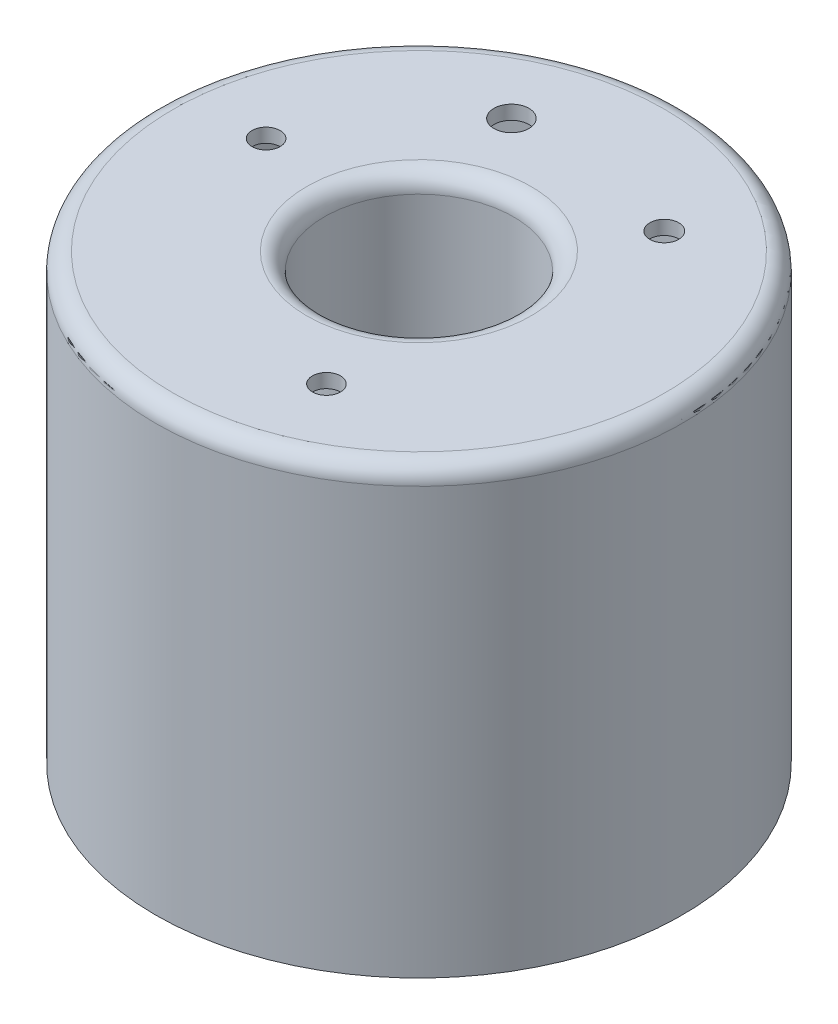
ISO-10303-21;
HEADER;
FILE_DESCRIPTION(('STEP AP214'),'2;1');
FILE_NAME('part.step','',(''),(''),'','','');
FILE_SCHEMA(('AUTOMOTIVE_DESIGN { 1 0 10303 214 1 1 1 1 }'));
ENDSEC;
DATA;
#1=APPLICATION_CONTEXT('core data for automotive mechanical design processes');
#2=APPLICATION_PROTOCOL_DEFINITION('international standard','automotive_design',2000,#1);
#3=PRODUCT_CONTEXT('',#1,'mechanical');
#4=PRODUCT('Part','Part','',(#3));
#5=PRODUCT_RELATED_PRODUCT_CATEGORY('part','',(#4));
#6=PRODUCT_DEFINITION_FORMATION('','',#4);
#7=PRODUCT_DEFINITION_CONTEXT('part definition',#1,'design');
#8=PRODUCT_DEFINITION('design','',#6,#7);
#9=PRODUCT_DEFINITION_SHAPE('','',#8);
#10=(LENGTH_UNIT() NAMED_UNIT(*) SI_UNIT(.MILLI.,.METRE.));
#11=(NAMED_UNIT(*) PLANE_ANGLE_UNIT() SI_UNIT($,.RADIAN.));
#12=(NAMED_UNIT(*) SI_UNIT($,.STERADIAN.) SOLID_ANGLE_UNIT());
#13=UNCERTAINTY_MEASURE_WITH_UNIT(LENGTH_MEASURE(1.E-05),#10,'distance_accuracy_value','');
#14=(GEOMETRIC_REPRESENTATION_CONTEXT(3) GLOBAL_UNCERTAINTY_ASSIGNED_CONTEXT((#13)) GLOBAL_UNIT_ASSIGNED_CONTEXT((#10,
#11,#12)) REPRESENTATION_CONTEXT('',''));
#15=CARTESIAN_POINT('',(0.,0.,0.));
#16=DIRECTION('',(0.,0.,1.));
#17=DIRECTION('',(1.,0.,0.));
#18=AXIS2_PLACEMENT_3D('',#15,#16,#17);
#19=CARTESIAN_POINT('',(0.,0.,0.));
#20=DIRECTION('',(0.,1.,0.));
#21=DIRECTION('',(0.,0.,1.));
#22=AXIS2_PLACEMENT_3D('',#19,#20,#21);
#23=PLANE('',#22);
#24=CARTESIAN_POINT('',(0.,0.,0.));
#25=DIRECTION('',(0.,1.,0.));
#26=DIRECTION('',(0.,0.,1.));
#27=AXIS2_PLACEMENT_3D('',#24,#25,#26);
#28=CIRCLE('',#27,13.716);
#29=CARTESIAN_POINT('',(0.,0.,13.716));
#30=VERTEX_POINT('',#29);
#31=EDGE_CURVE('E79',#30,#30,#28,.T.);
#32=ORIENTED_EDGE('',*,*,#31,.T.);
#33=EDGE_LOOP('',(#32));
#34=FACE_BOUND('',#33,.T.);
#35=CARTESIAN_POINT('',(0.,0.,0.));
#36=DIRECTION('',(0.,-1.,0.));
#37=DIRECTION('',(0.,0.,-1.));
#38=AXIS2_PLACEMENT_3D('',#35,#36,#37);
#39=CIRCLE('',#38,14.097);
#40=CARTESIAN_POINT('',(0.,0.,-14.097));
#41=VERTEX_POINT('',#40);
#42=EDGE_CURVE('E50',#41,#41,#39,.T.);
#43=ORIENTED_EDGE('',*,*,#42,.T.);
#44=EDGE_LOOP('',(#43));
#45=FACE_BOUND('',#44,.T.);
#46=ADVANCED_FACE('F30',(#34,#45),#23,.F.);
#47=CARTESIAN_POINT('',(0.,64.262,0.));
#48=DIRECTION('',(0.,1.,0.));
#49=DIRECTION('',(0.,0.,1.));
#50=AXIS2_PLACEMENT_3D('',#47,#48,#49);
#51=PLANE('',#50);
#52=CARTESIAN_POINT('',(9.95874815339066,64.262,23.3662862949451));
#53=DIRECTION('',(0.,1.,0.));
#54=DIRECTION('',(0.,0.,1.));
#55=AXIS2_PLACEMENT_3D('',#52,#53,#54);
#56=CIRCLE('',#55,2.032);
#57=CARTESIAN_POINT('',(9.95874815339066,64.262,25.3982862949451));
#58=VERTEX_POINT('',#57);
#59=EDGE_CURVE('E55',#58,#58,#56,.T.);
#60=ORIENTED_EDGE('',*,*,#59,.F.);
#61=EDGE_LOOP('',(#60));
#62=FACE_BOUND('',#61,.T.);
#63=CARTESIAN_POINT('',(-25.2151716002179,64.262,-3.05861425674499));
#64=DIRECTION('',(0.,1.,0.));
#65=DIRECTION('',(0.,0.,1.));
#66=AXIS2_PLACEMENT_3D('',#63,#64,#65);
#67=CIRCLE('',#66,2.032);
#68=CARTESIAN_POINT('',(-25.2151716002179,64.262,-1.02661425674499));
#69=VERTEX_POINT('',#68);
#70=EDGE_CURVE('E161',#69,#69,#67,.T.);
#71=ORIENTED_EDGE('',*,*,#70,.F.);
#72=EDGE_LOOP('',(#71));
#73=FACE_BOUND('',#72,.T.);
#74=CARTESIAN_POINT('',(-9.95874815339044,64.262,-23.3662862949451));
#75=DIRECTION('',(0.,1.,0.));
#76=DIRECTION('',(0.,0.,1.));
#77=AXIS2_PLACEMENT_3D('',#74,#75,#76);
#78=CIRCLE('',#77,2.54);
#79=CARTESIAN_POINT('',(-9.95874815339044,64.262,-20.826286294945));
#80=VERTEX_POINT('',#79);
#81=EDGE_CURVE('E68',#80,#80,#78,.T.);
#82=ORIENTED_EDGE('',*,*,#81,.F.);
#83=EDGE_LOOP('',(#82));
#84=FACE_BOUND('',#83,.T.);
#85=CARTESIAN_POINT('',(15.2564234468275,64.262,-20.3076720382001));
#86=DIRECTION('',(0.,1.,0.));
#87=DIRECTION('',(0.,0.,1.));
#88=AXIS2_PLACEMENT_3D('',#85,#86,#87);
#89=CIRCLE('',#88,2.0936950250961);
#90=CARTESIAN_POINT('',(15.2564234468275,64.262,-18.213977013104));
#91=VERTEX_POINT('',#90);
#92=EDGE_CURVE('E51',#91,#91,#89,.T.);
#93=ORIENTED_EDGE('',*,*,#92,.F.);
#94=EDGE_LOOP('',(#93));
#95=FACE_BOUND('',#94,.T.);
#96=CARTESIAN_POINT('',(0.,64.262,0.));
#97=DIRECTION('',(0.,1.,0.));
#98=DIRECTION('',(0.,0.,1.));
#99=AXIS2_PLACEMENT_3D('',#96,#97,#98);
#100=CIRCLE('',#99,16.256);
#101=CARTESIAN_POINT('',(0.,64.262,16.256));
#102=VERTEX_POINT('',#101);
#103=EDGE_CURVE('E38',#102,#102,#100,.F.);
#104=ORIENTED_EDGE('',*,*,#103,.T.);
#105=EDGE_LOOP('',(#104));
#106=FACE_BOUND('',#105,.T.);
#107=CARTESIAN_POINT('',(0.,64.262,0.));
#108=DIRECTION('',(0.,1.,0.));
#109=DIRECTION('',(0.,0.,1.));
#110=AXIS2_PLACEMENT_3D('',#107,#108,#109);
#111=CIRCLE('',#110,35.6235);
#112=CARTESIAN_POINT('',(0.,64.262,35.6235));
#113=VERTEX_POINT('',#112);
#114=EDGE_CURVE('E43',#113,#113,#111,.T.);
#115=ORIENTED_EDGE('',*,*,#114,.T.);
#116=EDGE_LOOP('',(#115));
#117=FACE_BOUND('',#116,.T.);
#118=ADVANCED_FACE('F92',(#62,#73,#84,#95,#106,#117),#51,.T.);
#119=CARTESIAN_POINT('',(0.,0.,0.));
#120=DIRECTION('',(0.,-1.,0.));
#121=DIRECTION('',(0.,0.,-1.));
#122=AXIS2_PLACEMENT_3D('',#119,#120,#121);
#123=CIRCLE('',#122,38.1);
#124=CARTESIAN_POINT('',(0.,0.,-38.1));
#125=VERTEX_POINT('',#124);
#126=EDGE_CURVE('E73',#125,#125,#123,.T.);
#127=ORIENTED_EDGE('',*,*,#126,.F.);
#128=EDGE_LOOP('',(#127));
#129=FACE_BOUND('',#128,.T.);
#130=CARTESIAN_POINT('',(0.,0.,0.));
#131=DIRECTION('',(0.,1.,0.));
#132=DIRECTION('',(0.,0.,1.));
#133=AXIS2_PLACEMENT_3D('',#130,#131,#132);
#134=CIRCLE('',#133,38.1635);
#135=CARTESIAN_POINT('',(0.,0.,38.1635));
#136=VERTEX_POINT('',#135);
#137=EDGE_CURVE('E84',#136,#136,#134,.T.);
#138=ORIENTED_EDGE('',*,*,#137,.F.);
#139=EDGE_LOOP('',(#138));
#140=FACE_BOUND('',#139,.T.);
#141=ADVANCED_FACE('F110',(#129,#140),#23,.F.);
#142=CARTESIAN_POINT('',(0.,64.262,0.));
#143=DIRECTION('',(0.,-1.,0.));
#144=DIRECTION('',(0.,0.,-1.));
#145=AXIS2_PLACEMENT_3D('',#142,#143,#144);
#146=CYLINDRICAL_SURFACE('',#145,38.1635);
#147=CARTESIAN_POINT('',(0.,61.722,0.));
#148=DIRECTION('',(0.,1.,0.));
#149=DIRECTION('',(0.,0.,1.));
#150=AXIS2_PLACEMENT_3D('',#147,#148,#149);
#151=CIRCLE('',#150,38.1635);
#152=CARTESIAN_POINT('',(0.,61.722,38.1635));
#153=VERTEX_POINT('',#152);
#154=EDGE_CURVE('E10',#153,#153,#151,.F.);
#155=ORIENTED_EDGE('',*,*,#154,.T.);
#156=EDGE_LOOP('',(#155));
#157=FACE_BOUND('',#156,.T.);
#158=ORIENTED_EDGE('',*,*,#137,.T.);
#159=EDGE_LOOP('',(#158));
#160=FACE_BOUND('',#159,.T.);
#161=ADVANCED_FACE('F119',(#157,#160),#146,.T.);
#162=CARTESIAN_POINT('',(0.,64.262,0.));
#163=DIRECTION('',(0.,-1.,0.));
#164=DIRECTION('',(0.,0.,-1.));
#165=AXIS2_PLACEMENT_3D('',#162,#163,#164);
#166=CYLINDRICAL_SURFACE('',#165,13.716);
#167=CARTESIAN_POINT('',(0.,61.722,0.));
#168=DIRECTION('',(0.,1.,0.));
#169=DIRECTION('',(0.,0.,1.));
#170=AXIS2_PLACEMENT_3D('',#167,#168,#169);
#171=CIRCLE('',#170,13.716);
#172=CARTESIAN_POINT('',(0.,61.722,13.716));
#173=VERTEX_POINT('',#172);
#174=EDGE_CURVE('E87',#173,#173,#171,.T.);
#175=ORIENTED_EDGE('',*,*,#174,.T.);
#176=EDGE_LOOP('',(#175));
#177=FACE_BOUND('',#176,.T.);
#178=ORIENTED_EDGE('',*,*,#31,.F.);
#179=EDGE_LOOP('',(#178));
#180=FACE_BOUND('',#179,.T.);
#181=ADVANCED_FACE('F124',(#177,#180),#166,.F.);
#182=CARTESIAN_POINT('',(0.,62.23,0.));
#183=DIRECTION('',(0.,-1.,0.));
#184=DIRECTION('',(0.,0.,-1.));
#185=AXIS2_PLACEMENT_3D('',#182,#183,#184);
#186=CYLINDRICAL_SURFACE('',#185,38.1);
#187=CARTESIAN_POINT('',(0.,62.23,0.));
#188=DIRECTION('',(0.,-1.,0.));
#189=DIRECTION('',(0.,0.,-1.));
#190=AXIS2_PLACEMENT_3D('',#187,#188,#189);
#191=CIRCLE('',#190,38.1);
#192=CARTESIAN_POINT('',(0.,62.23,-38.1));
#193=VERTEX_POINT('',#192);
#194=EDGE_CURVE('E76',#193,#193,#191,.T.);
#195=CARTESIAN_POINT('',(0.,62.23,-38.1));
#196=CARTESIAN_POINT('',(0.,61.5817708333333,-38.1));
#197=CARTESIAN_POINT('',(0.,60.9335416666667,-38.1));
#198=CARTESIAN_POINT('',(0.,59.6370833333333,-38.1));
#199=CARTESIAN_POINT('',(0.,58.9888541666667,-38.1));
#200=CARTESIAN_POINT('',(0.,57.6923958333333,-38.1));
#201=CARTESIAN_POINT('',(0.,57.0441666666667,-38.1));
#202=CARTESIAN_POINT('',(0.,55.7477083333333,-38.1));
#203=CARTESIAN_POINT('',(0.,55.0994791666667,-38.1));
#204=CARTESIAN_POINT('',(0.,53.8030208333333,-38.1));
#205=CARTESIAN_POINT('',(0.,53.1547916666667,-38.1));
#206=CARTESIAN_POINT('',(0.,51.8583333333333,-38.1));
#207=CARTESIAN_POINT('',(0.,51.2101041666667,-38.1));
#208=CARTESIAN_POINT('',(0.,49.9136458333333,-38.1));
#209=CARTESIAN_POINT('',(0.,49.2654166666667,-38.1));
#210=CARTESIAN_POINT('',(0.,47.9689583333333,-38.1));
#211=CARTESIAN_POINT('',(0.,47.3207291666667,-38.1));
#212=CARTESIAN_POINT('',(0.,46.0242708333333,-38.1));
#213=CARTESIAN_POINT('',(0.,45.3760416666667,-38.1));
#214=CARTESIAN_POINT('',(0.,44.0795833333333,-38.1));
#215=CARTESIAN_POINT('',(0.,43.4313541666667,-38.1));
#216=CARTESIAN_POINT('',(0.,42.1348958333333,-38.1));
#217=CARTESIAN_POINT('',(0.,41.4866666666667,-38.1));
#218=CARTESIAN_POINT('',(0.,40.1902083333333,-38.1));
#219=CARTESIAN_POINT('',(0.,39.5419791666667,-38.1));
#220=CARTESIAN_POINT('',(0.,38.2455208333333,-38.1));
#221=CARTESIAN_POINT('',(0.,37.5972916666667,-38.1));
#222=CARTESIAN_POINT('',(0.,36.3008333333333,-38.1));
#223=CARTESIAN_POINT('',(0.,35.6526041666667,-38.1));
#224=CARTESIAN_POINT('',(0.,34.3561458333333,-38.1));
#225=CARTESIAN_POINT('',(0.,33.7079166666667,-38.1));
#226=CARTESIAN_POINT('',(0.,32.4114583333333,-38.1));
#227=CARTESIAN_POINT('',(0.,31.7632291666667,-38.1));
#228=CARTESIAN_POINT('',(0.,30.4667708333333,-38.1));
#229=CARTESIAN_POINT('',(0.,29.8185416666667,-38.1));
#230=CARTESIAN_POINT('',(0.,28.5220833333333,-38.1));
#231=CARTESIAN_POINT('',(0.,27.8738541666667,-38.1));
#232=CARTESIAN_POINT('',(0.,26.5773958333333,-38.1));
#233=CARTESIAN_POINT('',(0.,25.9291666666667,-38.1));
#234=CARTESIAN_POINT('',(0.,24.6327083333333,-38.1));
#235=CARTESIAN_POINT('',(0.,23.9844791666667,-38.1));
#236=CARTESIAN_POINT('',(0.,22.6880208333333,-38.1));
#237=CARTESIAN_POINT('',(0.,22.0397916666667,-38.1));
#238=CARTESIAN_POINT('',(0.,20.7433333333333,-38.1));
#239=CARTESIAN_POINT('',(0.,20.0951041666667,-38.1));
#240=CARTESIAN_POINT('',(0.,18.7986458333333,-38.1));
#241=CARTESIAN_POINT('',(0.,18.1504166666667,-38.1));
#242=CARTESIAN_POINT('',(0.,16.8539583333333,-38.1));
#243=CARTESIAN_POINT('',(0.,16.2057291666667,-38.1));
#244=CARTESIAN_POINT('',(0.,14.9092708333333,-38.1));
#245=CARTESIAN_POINT('',(0.,14.2610416666667,-38.1));
#246=CARTESIAN_POINT('',(0.,12.9645833333333,-38.1));
#247=CARTESIAN_POINT('',(0.,12.3163541666667,-38.1));
#248=CARTESIAN_POINT('',(0.,11.0198958333333,-38.1));
#249=CARTESIAN_POINT('',(0.,10.3716666666667,-38.1));
#250=CARTESIAN_POINT('',(0.,9.07520833333333,-38.1));
#251=CARTESIAN_POINT('',(0.,8.42697916666667,-38.1));
#252=CARTESIAN_POINT('',(0.,7.13052083333333,-38.1));
#253=CARTESIAN_POINT('',(0.,6.48229166666667,-38.1));
#254=CARTESIAN_POINT('',(0.,5.18583333333333,-38.1));
#255=CARTESIAN_POINT('',(0.,4.53760416666667,-38.1));
#256=CARTESIAN_POINT('',(0.,3.24114583333333,-38.1));
#257=CARTESIAN_POINT('',(0.,2.59291666666667,-38.1));
#258=CARTESIAN_POINT('',(0.,1.29645833333333,-38.1));
#259=CARTESIAN_POINT('',(0.,0.648229166666666,-38.1));
#260=CARTESIAN_POINT('',(0.,0.,-38.1));
#261=B_SPLINE_CURVE_WITH_KNOTS('',3,(#195,#196,#197,#198,#199,#200,#201,#202,#203,#204,#205,
#206,#207,#208,#209,#210,#211,#212,#213,#214,#215,#216,#217,#218,#219,#220,#221,#222,#223,#224,
#225,#226,#227,#228,#229,#230,#231,#232,#233,#234,#235,#236,#237,#238,#239,#240,#241,#242,#243,
#244,#245,#246,#247,#248,#249,#250,#251,#252,#253,#254,#255,#256,#257,#258,#259,#260),
.UNSPECIFIED.,.F.,.F.,(4,2,2,2,2,2,2,2,2,2,2,2,2,2,2,2,2,2,2,2,2,2,2,2,2,2,2,2,2,2,2,2,4),(0.,
1.94468749999999,3.88937499999999,5.83406249999999,7.77874999999999,9.72343749999999,11.668125,
13.6128125,15.5575,17.5021875,19.446875,21.3915625,23.33625,25.2809375,27.225625,29.1703125,
31.115,33.0596875,35.004375,36.9490625,38.89375,40.8384375,42.783125,44.7278125,46.6725,
48.6171875,50.561875,52.5065625,54.45125,56.3959375,58.340625,60.2853125,62.23),.UNSPECIFIED.);
#262=EDGE_CURVE('BSEAM130',#193,#125,#261,.T.);
#263=ORIENTED_EDGE('',*,*,#194,.F.);
#264=ORIENTED_EDGE('',*,*,#126,.T.);
#265=ORIENTED_EDGE('',*,*,#262,.T.);
#266=ORIENTED_EDGE('',*,*,#262,.F.);
#267=EDGE_LOOP('',(#263,#265,#264,#266));
#268=FACE_BOUND('',#267,.T.);
#269=ADVANCED_FACE('F130',(#268),#186,.F.);
#270=CARTESIAN_POINT('',(0.,62.23,0.));
#271=DIRECTION('',(0.,-1.,0.));
#272=DIRECTION('',(0.,0.,-1.));
#273=AXIS2_PLACEMENT_3D('',#270,#271,#272);
#274=PLANE('',#273);
#275=CARTESIAN_POINT('',(9.95874815339066,62.23,23.3662862949451));
#276=DIRECTION('',(0.,-1.,0.));
#277=DIRECTION('',(0.,0.,-1.));
#278=AXIS2_PLACEMENT_3D('',#275,#276,#277);
#279=CIRCLE('',#278,2.032);
#280=CARTESIAN_POINT('',(9.95874815339066,62.23,21.3342862949451));
#281=VERTEX_POINT('',#280);
#282=EDGE_CURVE('E34',#281,#281,#279,.T.);
#283=ORIENTED_EDGE('',*,*,#282,.F.);
#284=EDGE_LOOP('',(#283));
#285=FACE_BOUND('',#284,.T.);
#286=CARTESIAN_POINT('',(-25.2151716002179,62.23,-3.05861425674499));
#287=DIRECTION('',(0.,-1.,0.));
#288=DIRECTION('',(0.,0.,-1.));
#289=AXIS2_PLACEMENT_3D('',#286,#287,#288);
#290=CIRCLE('',#289,2.032);
#291=CARTESIAN_POINT('',(-25.2151716002179,62.23,-5.09061425674499));
#292=VERTEX_POINT('',#291);
#293=EDGE_CURVE('E54',#292,#292,#290,.T.);
#294=ORIENTED_EDGE('',*,*,#293,.F.);
#295=EDGE_LOOP('',(#294));
#296=FACE_BOUND('',#295,.T.);
#297=CARTESIAN_POINT('',(-9.95874815339044,62.23,-23.3662862949451));
#298=DIRECTION('',(0.,-1.,0.));
#299=DIRECTION('',(0.,0.,-1.));
#300=AXIS2_PLACEMENT_3D('',#297,#298,#299);
#301=CIRCLE('',#300,2.54);
#302=CARTESIAN_POINT('',(-9.95874815339044,62.23,-25.9062862949451));
#303=VERTEX_POINT('',#302);
#304=EDGE_CURVE('E52',#303,#303,#301,.T.);
#305=ORIENTED_EDGE('',*,*,#304,.F.);
#306=EDGE_LOOP('',(#305));
#307=FACE_BOUND('',#306,.T.);
#308=CARTESIAN_POINT('',(15.2564234468275,62.23,-20.3076720382001));
#309=DIRECTION('',(0.,-1.,0.));
#310=DIRECTION('',(0.,0.,-1.));
#311=AXIS2_PLACEMENT_3D('',#308,#309,#310);
#312=CIRCLE('',#311,2.0936950250961);
#313=CARTESIAN_POINT('',(15.2564234468275,62.23,-22.4013670632962));
#314=VERTEX_POINT('',#313);
#315=EDGE_CURVE('E47',#314,#314,#312,.T.);
#316=ORIENTED_EDGE('',*,*,#315,.F.);
#317=EDGE_LOOP('',(#316));
#318=FACE_BOUND('',#317,.T.);
#319=CARTESIAN_POINT('',(0.,62.23,0.));
#320=DIRECTION('',(0.,-1.,0.));
#321=DIRECTION('',(0.,0.,-1.));
#322=AXIS2_PLACEMENT_3D('',#319,#320,#321);
#323=CIRCLE('',#322,14.097);
#324=CARTESIAN_POINT('',(0.,62.23,-14.097));
#325=VERTEX_POINT('',#324);
#326=EDGE_CURVE('E70',#325,#325,#323,.T.);
#327=ORIENTED_EDGE('',*,*,#326,.F.);
#328=EDGE_LOOP('',(#327));
#329=FACE_BOUND('',#328,.T.);
#330=ORIENTED_EDGE('',*,*,#194,.T.);
#331=EDGE_LOOP('',(#330));
#332=FACE_BOUND('',#331,.T.);
#333=ADVANCED_FACE('F132',(#285,#296,#307,#318,#329,#332),#274,.T.);
#334=CARTESIAN_POINT('',(0.,62.23,0.));
#335=DIRECTION('',(0.,-1.,0.));
#336=DIRECTION('',(0.,0.,-1.));
#337=AXIS2_PLACEMENT_3D('',#334,#335,#336);
#338=CYLINDRICAL_SURFACE('',#337,14.097);
#339=CARTESIAN_POINT('',(0.,62.23,-14.097));
#340=CARTESIAN_POINT('',(0.,61.5817708333333,-14.097));
#341=CARTESIAN_POINT('',(0.,60.9335416666667,-14.097));
#342=CARTESIAN_POINT('',(0.,59.6370833333333,-14.097));
#343=CARTESIAN_POINT('',(0.,58.9888541666667,-14.097));
#344=CARTESIAN_POINT('',(0.,57.6923958333333,-14.097));
#345=CARTESIAN_POINT('',(0.,57.0441666666667,-14.097));
#346=CARTESIAN_POINT('',(0.,55.7477083333333,-14.097));
#347=CARTESIAN_POINT('',(0.,55.0994791666667,-14.097));
#348=CARTESIAN_POINT('',(0.,53.8030208333333,-14.097));
#349=CARTESIAN_POINT('',(0.,53.1547916666667,-14.097));
#350=CARTESIAN_POINT('',(0.,51.8583333333333,-14.097));
#351=CARTESIAN_POINT('',(0.,51.2101041666667,-14.097));
#352=CARTESIAN_POINT('',(0.,49.9136458333333,-14.097));
#353=CARTESIAN_POINT('',(0.,49.2654166666667,-14.097));
#354=CARTESIAN_POINT('',(0.,47.9689583333333,-14.097));
#355=CARTESIAN_POINT('',(0.,47.3207291666667,-14.097));
#356=CARTESIAN_POINT('',(0.,46.0242708333333,-14.097));
#357=CARTESIAN_POINT('',(0.,45.3760416666667,-14.097));
#358=CARTESIAN_POINT('',(0.,44.0795833333333,-14.097));
#359=CARTESIAN_POINT('',(0.,43.4313541666667,-14.097));
#360=CARTESIAN_POINT('',(0.,42.1348958333333,-14.097));
#361=CARTESIAN_POINT('',(0.,41.4866666666667,-14.097));
#362=CARTESIAN_POINT('',(0.,40.1902083333333,-14.097));
#363=CARTESIAN_POINT('',(0.,39.5419791666667,-14.097));
#364=CARTESIAN_POINT('',(0.,38.2455208333333,-14.097));
#365=CARTESIAN_POINT('',(0.,37.5972916666667,-14.097));
#366=CARTESIAN_POINT('',(0.,36.3008333333333,-14.097));
#367=CARTESIAN_POINT('',(0.,35.6526041666667,-14.097));
#368=CARTESIAN_POINT('',(0.,34.3561458333333,-14.097));
#369=CARTESIAN_POINT('',(0.,33.7079166666667,-14.097));
#370=CARTESIAN_POINT('',(0.,32.4114583333333,-14.097));
#371=CARTESIAN_POINT('',(0.,31.7632291666667,-14.097));
#372=CARTESIAN_POINT('',(0.,30.4667708333333,-14.097));
#373=CARTESIAN_POINT('',(0.,29.8185416666667,-14.097));
#374=CARTESIAN_POINT('',(0.,28.5220833333333,-14.097));
#375=CARTESIAN_POINT('',(0.,27.8738541666667,-14.097));
#376=CARTESIAN_POINT('',(0.,26.5773958333333,-14.097));
#377=CARTESIAN_POINT('',(0.,25.9291666666667,-14.097));
#378=CARTESIAN_POINT('',(0.,24.6327083333333,-14.097));
#379=CARTESIAN_POINT('',(0.,23.9844791666667,-14.097));
#380=CARTESIAN_POINT('',(0.,22.6880208333333,-14.097));
#381=CARTESIAN_POINT('',(0.,22.0397916666667,-14.097));
#382=CARTESIAN_POINT('',(0.,20.7433333333333,-14.097));
#383=CARTESIAN_POINT('',(0.,20.0951041666667,-14.097));
#384=CARTESIAN_POINT('',(0.,18.7986458333333,-14.097));
#385=CARTESIAN_POINT('',(0.,18.1504166666667,-14.097));
#386=CARTESIAN_POINT('',(0.,16.8539583333333,-14.097));
#387=CARTESIAN_POINT('',(0.,16.2057291666667,-14.097));
#388=CARTESIAN_POINT('',(0.,14.9092708333333,-14.097));
#389=CARTESIAN_POINT('',(0.,14.2610416666667,-14.097));
#390=CARTESIAN_POINT('',(0.,12.9645833333333,-14.097));
#391=CARTESIAN_POINT('',(0.,12.3163541666667,-14.097));
#392=CARTESIAN_POINT('',(0.,11.0198958333333,-14.097));
#393=CARTESIAN_POINT('',(0.,10.3716666666667,-14.097));
#394=CARTESIAN_POINT('',(0.,9.07520833333333,-14.097));
#395=CARTESIAN_POINT('',(0.,8.42697916666667,-14.097));
#396=CARTESIAN_POINT('',(0.,7.13052083333333,-14.097));
#397=CARTESIAN_POINT('',(0.,6.48229166666667,-14.097));
#398=CARTESIAN_POINT('',(0.,5.18583333333333,-14.097));
#399=CARTESIAN_POINT('',(0.,4.53760416666667,-14.097));
#400=CARTESIAN_POINT('',(0.,3.24114583333333,-14.097));
#401=CARTESIAN_POINT('',(0.,2.59291666666667,-14.097));
#402=CARTESIAN_POINT('',(0.,1.29645833333333,-14.097));
#403=CARTESIAN_POINT('',(0.,0.648229166666667,-14.097));
#404=CARTESIAN_POINT('',(0.,0.,-14.097));
#405=B_SPLINE_CURVE_WITH_KNOTS('',3,(#339,#340,#341,#342,#343,#344,#345,#346,#347,#348,#349,
#350,#351,#352,#353,#354,#355,#356,#357,#358,#359,#360,#361,#362,#363,#364,#365,#366,#367,#368,
#369,#370,#371,#372,#373,#374,#375,#376,#377,#378,#379,#380,#381,#382,#383,#384,#385,#386,#387,
#388,#389,#390,#391,#392,#393,#394,#395,#396,#397,#398,#399,#400,#401,#402,#403,#404),
.UNSPECIFIED.,.F.,.F.,(4,2,2,2,2,2,2,2,2,2,2,2,2,2,2,2,2,2,2,2,2,2,2,2,2,2,2,2,2,2,2,2,4),(0.,
1.9446875,3.889375,5.8340625,7.77875,9.7234375,11.668125,13.6128125,15.5575,17.5021875,
19.446875,21.3915625,23.33625,25.2809375,27.225625,29.1703125,31.115,33.0596875,35.004375,
36.9490625,38.89375,40.8384375,42.783125,44.7278125,46.6725,48.6171875,50.561875,52.5065625,
54.45125,56.3959375,58.340625,60.2853125,62.23),.UNSPECIFIED.);
#406=EDGE_CURVE('BSEAM105',#325,#41,#405,.T.);
#407=ORIENTED_EDGE('',*,*,#326,.T.);
#408=ORIENTED_EDGE('',*,*,#42,.F.);
#409=ORIENTED_EDGE('',*,*,#406,.T.);
#410=ORIENTED_EDGE('',*,*,#406,.F.);
#411=EDGE_LOOP('',(#407,#409,#408,#410));
#412=FACE_BOUND('',#411,.T.);
#413=ADVANCED_FACE('F105',(#412),#338,.T.);
#414=CARTESIAN_POINT('',(0.,61.722,0.));
#415=DIRECTION('',(0.,1.,0.));
#416=DIRECTION('',(0.,0.,1.));
#417=AXIS2_PLACEMENT_3D('',#414,#415,#416);
#418=TOROIDAL_SURFACE('',#417,16.256,2.54);
#419=ORIENTED_EDGE('',*,*,#103,.F.);
#420=EDGE_LOOP('',(#419));
#421=FACE_BOUND('',#420,.T.);
#422=ORIENTED_EDGE('',*,*,#174,.F.);
#423=EDGE_LOOP('',(#422));
#424=FACE_BOUND('',#423,.T.);
#425=ADVANCED_FACE('F96',(#421,#424),#418,.T.);
#426=CARTESIAN_POINT('',(0.,61.722,0.));
#427=DIRECTION('',(0.,1.,0.));
#428=DIRECTION('',(0.,0.,1.));
#429=AXIS2_PLACEMENT_3D('',#426,#427,#428);
#430=TOROIDAL_SURFACE('',#429,35.6235,2.54);
#431=ORIENTED_EDGE('',*,*,#154,.F.);
#432=EDGE_LOOP('',(#431));
#433=FACE_BOUND('',#432,.T.);
#434=ORIENTED_EDGE('',*,*,#114,.F.);
#435=EDGE_LOOP('',(#434));
#436=FACE_BOUND('',#435,.T.);
#437=ADVANCED_FACE('F32',(#433,#436),#430,.T.);
#438=CARTESIAN_POINT('',(15.2564234468275,61.722,-20.3076720382001));
#439=DIRECTION('',(0.,1.,0.));
#440=DIRECTION('',(0.,0.,1.));
#441=AXIS2_PLACEMENT_3D('',#438,#439,#440);
#442=CYLINDRICAL_SURFACE('',#441,2.0936950250961);
#443=ORIENTED_EDGE('',*,*,#315,.T.);
#444=EDGE_LOOP('',(#443));
#445=FACE_BOUND('',#444,.T.);
#446=ORIENTED_EDGE('',*,*,#92,.T.);
#447=EDGE_LOOP('',(#446));
#448=FACE_BOUND('',#447,.T.);
#449=ADVANCED_FACE('F95',(#445,#448),#442,.F.);
#450=CARTESIAN_POINT('',(-9.95874815339044,61.722,-23.3662862949451));
#451=DIRECTION('',(0.,1.,0.));
#452=DIRECTION('',(0.,0.,1.));
#453=AXIS2_PLACEMENT_3D('',#450,#451,#452);
#454=CYLINDRICAL_SURFACE('',#453,2.54);
#455=ORIENTED_EDGE('',*,*,#304,.T.);
#456=EDGE_LOOP('',(#455));
#457=FACE_BOUND('',#456,.T.);
#458=ORIENTED_EDGE('',*,*,#81,.T.);
#459=EDGE_LOOP('',(#458));
#460=FACE_BOUND('',#459,.T.);
#461=ADVANCED_FACE('F102',(#457,#460),#454,.F.);
#462=CARTESIAN_POINT('',(-25.2151716002179,61.722,-3.05861425674499));
#463=DIRECTION('',(0.,1.,0.));
#464=DIRECTION('',(0.,0.,1.));
#465=AXIS2_PLACEMENT_3D('',#462,#463,#464);
#466=CYLINDRICAL_SURFACE('',#465,2.032);
#467=ORIENTED_EDGE('',*,*,#293,.T.);
#468=EDGE_LOOP('',(#467));
#469=FACE_BOUND('',#468,.T.);
#470=ORIENTED_EDGE('',*,*,#70,.T.);
#471=EDGE_LOOP('',(#470));
#472=FACE_BOUND('',#471,.T.);
#473=ADVANCED_FACE('F150',(#469,#472),#466,.F.);
#474=CARTESIAN_POINT('',(9.95874815339066,61.722,23.3662862949451));
#475=DIRECTION('',(0.,1.,0.));
#476=DIRECTION('',(0.,0.,1.));
#477=AXIS2_PLACEMENT_3D('',#474,#475,#476);
#478=CYLINDRICAL_SURFACE('',#477,2.032);
#479=ORIENTED_EDGE('',*,*,#282,.T.);
#480=EDGE_LOOP('',(#479));
#481=FACE_BOUND('',#480,.T.);
#482=ORIENTED_EDGE('',*,*,#59,.T.);
#483=EDGE_LOOP('',(#482));
#484=FACE_BOUND('',#483,.T.);
#485=ADVANCED_FACE('F154',(#481,#484),#478,.F.);
#486=CLOSED_SHELL('',(#46,#118,#141,#161,#181,#269,#333,#413,#425,#437,#449,#461,#473,#485));
#487=MANIFOLD_SOLID_BREP('B2',#486);
#488=ADVANCED_BREP_SHAPE_REPRESENTATION('',(#18,#487),#14);
#489=SHAPE_DEFINITION_REPRESENTATION(#9,#488);
ENDSEC;
END-ISO-10303-21;
